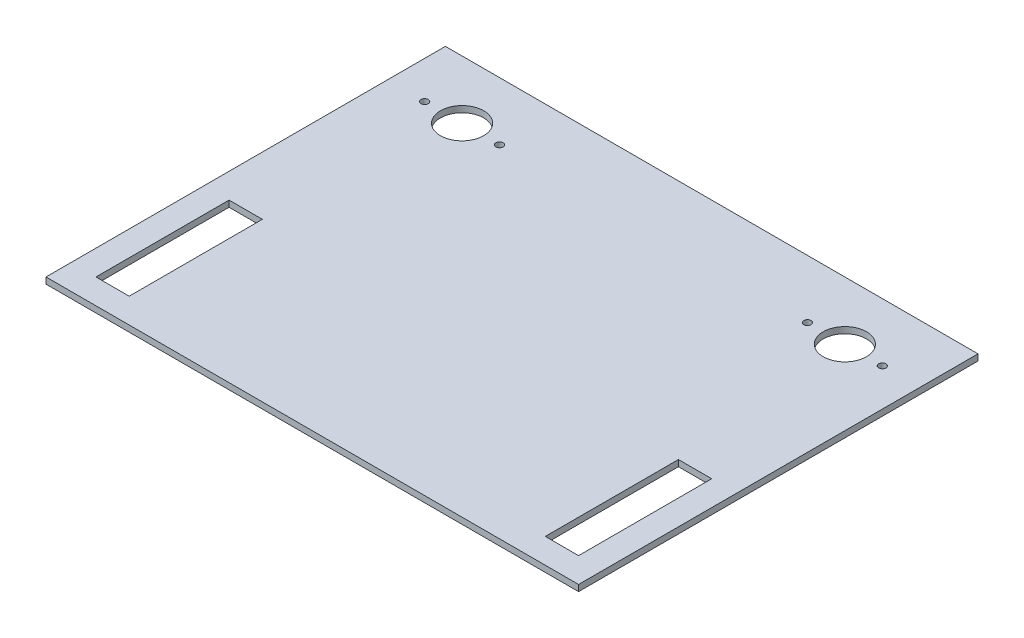
ISO-10303-21;
HEADER;
FILE_DESCRIPTION(('STEP AP214'),'2;1');
FILE_NAME('part.step','',(''),(''),'','','');
FILE_SCHEMA(('AUTOMOTIVE_DESIGN { 1 0 10303 214 1 1 1 1 }'));
ENDSEC;
DATA;
#1=APPLICATION_CONTEXT('core data for automotive mechanical design processes');
#2=APPLICATION_PROTOCOL_DEFINITION('international standard','automotive_design',2000,#1);
#3=PRODUCT_CONTEXT('',#1,'mechanical');
#4=PRODUCT('Part','Part','',(#3));
#5=PRODUCT_RELATED_PRODUCT_CATEGORY('part','',(#4));
#6=PRODUCT_DEFINITION_FORMATION('','',#4);
#7=PRODUCT_DEFINITION_CONTEXT('part definition',#1,'design');
#8=PRODUCT_DEFINITION('design','',#6,#7);
#9=PRODUCT_DEFINITION_SHAPE('','',#8);
#10=(LENGTH_UNIT() NAMED_UNIT(*) SI_UNIT(.MILLI.,.METRE.));
#11=(NAMED_UNIT(*) PLANE_ANGLE_UNIT() SI_UNIT($,.RADIAN.));
#12=(NAMED_UNIT(*) SI_UNIT($,.STERADIAN.) SOLID_ANGLE_UNIT());
#13=UNCERTAINTY_MEASURE_WITH_UNIT(LENGTH_MEASURE(1.E-05),#10,'distance_accuracy_value','');
#14=(GEOMETRIC_REPRESENTATION_CONTEXT(3) GLOBAL_UNCERTAINTY_ASSIGNED_CONTEXT((#13)) GLOBAL_UNIT_ASSIGNED_CONTEXT((#10,
#11,#12)) REPRESENTATION_CONTEXT('',''));
#15=CARTESIAN_POINT('',(0.,0.,0.));
#16=DIRECTION('',(0.,0.,1.));
#17=DIRECTION('',(1.,0.,0.));
#18=AXIS2_PLACEMENT_3D('',#15,#16,#17);
#19=CARTESIAN_POINT('',(0.,4.7625,0.));
#20=DIRECTION('',(1.,0.,0.));
#21=DIRECTION('',(0.,0.,-1.));
#22=AXIS2_PLACEMENT_3D('',#19,#20,#21);
#23=PLANE('',#22);
#24=DIRECTION('',(0.,0.,1.));
#25=VECTOR('',#24,1.);
#26=CARTESIAN_POINT('',(0.,0.,0.));
#27=LINE('',#26,#25);
#28=CARTESIAN_POINT('',(0.,0.,-304.8));
#29=VERTEX_POINT('',#28);
#30=CARTESIAN_POINT('',(0.,0.,0.));
#31=VERTEX_POINT('',#30);
#32=EDGE_CURVE('E216',#29,#31,#27,.T.);
#33=ORIENTED_EDGE('',*,*,#32,.T.);
#34=DIRECTION('',(0.,-1.,0.));
#35=VECTOR('',#34,1.);
#36=CARTESIAN_POINT('',(0.,4.7625,0.));
#37=LINE('',#36,#35);
#38=CARTESIAN_POINT('',(0.,4.7625,0.));
#39=VERTEX_POINT('',#38);
#40=EDGE_CURVE('E239',#39,#31,#37,.T.);
#41=ORIENTED_EDGE('',*,*,#40,.F.);
#42=DIRECTION('',(0.,0.,1.));
#43=VECTOR('',#42,1.);
#44=CARTESIAN_POINT('',(0.,4.7625,0.));
#45=LINE('',#44,#43);
#46=CARTESIAN_POINT('',(0.,4.7625,-304.8));
#47=VERTEX_POINT('',#46);
#48=EDGE_CURVE('E201',#47,#39,#45,.T.);
#49=ORIENTED_EDGE('',*,*,#48,.F.);
#50=DIRECTION('',(0.,-1.,0.));
#51=VECTOR('',#50,1.);
#52=CARTESIAN_POINT('',(0.,4.7625,-304.8));
#53=LINE('',#52,#51);
#54=EDGE_CURVE('E215',#47,#29,#53,.T.);
#55=ORIENTED_EDGE('',*,*,#54,.T.);
#56=EDGE_LOOP('',(#33,#41,#49,#55));
#57=FACE_BOUND('',#56,.T.);
#58=ADVANCED_FACE('F39',(#57),#23,.F.);
#59=CARTESIAN_POINT('',(0.,4.7625,0.));
#60=DIRECTION('',(0.,0.,-1.));
#61=DIRECTION('',(-1.,0.,0.));
#62=AXIS2_PLACEMENT_3D('',#59,#60,#61);
#63=PLANE('',#62);
#64=DIRECTION('',(1.,0.,0.));
#65=VECTOR('',#64,1.);
#66=CARTESIAN_POINT('',(0.,0.,0.));
#67=LINE('',#66,#65);
#68=CARTESIAN_POINT('',(406.4,0.,0.));
#69=VERTEX_POINT('',#68);
#70=EDGE_CURVE('E220',#31,#69,#67,.T.);
#71=ORIENTED_EDGE('',*,*,#70,.T.);
#72=DIRECTION('',(0.,-1.,0.));
#73=VECTOR('',#72,1.);
#74=CARTESIAN_POINT('',(406.4,4.7625,0.));
#75=LINE('',#74,#73);
#76=CARTESIAN_POINT('',(406.4,4.7625,0.));
#77=VERTEX_POINT('',#76);
#78=EDGE_CURVE('E235',#77,#69,#75,.T.);
#79=ORIENTED_EDGE('',*,*,#78,.F.);
#80=DIRECTION('',(1.,0.,0.));
#81=VECTOR('',#80,1.);
#82=CARTESIAN_POINT('',(0.,4.7625,0.));
#83=LINE('',#82,#81);
#84=EDGE_CURVE('E205',#39,#77,#83,.T.);
#85=ORIENTED_EDGE('',*,*,#84,.F.);
#86=ORIENTED_EDGE('',*,*,#40,.T.);
#87=EDGE_LOOP('',(#71,#79,#85,#86));
#88=FACE_BOUND('',#87,.T.);
#89=ADVANCED_FACE('F326',(#88),#63,.F.);
#90=CARTESIAN_POINT('',(406.4,4.7625,0.));
#91=DIRECTION('',(-1.,0.,0.));
#92=DIRECTION('',(0.,0.,1.));
#93=AXIS2_PLACEMENT_3D('',#90,#91,#92);
#94=PLANE('',#93);
#95=DIRECTION('',(0.,0.,-1.));
#96=VECTOR('',#95,1.);
#97=CARTESIAN_POINT('',(406.4,0.,0.));
#98=LINE('',#97,#96);
#99=CARTESIAN_POINT('',(406.4,0.,-304.8));
#100=VERTEX_POINT('',#99);
#101=EDGE_CURVE('E223',#69,#100,#98,.T.);
#102=ORIENTED_EDGE('',*,*,#101,.T.);
#103=DIRECTION('',(0.,-1.,0.));
#104=VECTOR('',#103,1.);
#105=CARTESIAN_POINT('',(406.4,4.7625,-304.8));
#106=LINE('',#105,#104);
#107=CARTESIAN_POINT('',(406.4,4.7625,-304.8));
#108=VERTEX_POINT('',#107);
#109=EDGE_CURVE('E231',#108,#100,#106,.T.);
#110=ORIENTED_EDGE('',*,*,#109,.F.);
#111=DIRECTION('',(0.,0.,-1.));
#112=VECTOR('',#111,1.);
#113=CARTESIAN_POINT('',(406.4,4.7625,0.));
#114=LINE('',#113,#112);
#115=EDGE_CURVE('E209',#77,#108,#114,.T.);
#116=ORIENTED_EDGE('',*,*,#115,.F.);
#117=ORIENTED_EDGE('',*,*,#78,.T.);
#118=EDGE_LOOP('',(#102,#110,#116,#117));
#119=FACE_BOUND('',#118,.T.);
#120=ADVANCED_FACE('F323',(#119),#94,.F.);
#121=CARTESIAN_POINT('',(0.,4.7625,-304.8));
#122=DIRECTION('',(0.,0.,1.));
#123=DIRECTION('',(1.,0.,0.));
#124=AXIS2_PLACEMENT_3D('',#121,#122,#123);
#125=PLANE('',#124);
#126=DIRECTION('',(-1.,0.,0.));
#127=VECTOR('',#126,1.);
#128=CARTESIAN_POINT('',(0.,0.,-304.8));
#129=LINE('',#128,#127);
#130=EDGE_CURVE('E206',#100,#29,#129,.T.);
#131=ORIENTED_EDGE('',*,*,#130,.T.);
#132=ORIENTED_EDGE('',*,*,#54,.F.);
#133=DIRECTION('',(-1.,0.,0.));
#134=VECTOR('',#133,1.);
#135=CARTESIAN_POINT('',(0.,4.7625,-304.8));
#136=LINE('',#135,#134);
#137=EDGE_CURVE('E212',#108,#47,#136,.T.);
#138=ORIENTED_EDGE('',*,*,#137,.F.);
#139=ORIENTED_EDGE('',*,*,#109,.T.);
#140=EDGE_LOOP('',(#131,#132,#138,#139));
#141=FACE_BOUND('',#140,.T.);
#142=ADVANCED_FACE('F319',(#141),#125,.F.);
#143=CARTESIAN_POINT('',(0.,4.7625,0.));
#144=DIRECTION('',(0.,-1.,0.));
#145=DIRECTION('',(0.,0.,-1.));
#146=AXIS2_PLACEMENT_3D('',#143,#144,#145);
#147=PLANE('',#146);
#148=CARTESIAN_POINT('',(28.575,4.7625,-260.35));
#149=DIRECTION('',(0.,1.,0.));
#150=DIRECTION('',(0.,0.,1.));
#151=AXIS2_PLACEMENT_3D('',#148,#149,#150);
#152=CIRCLE('',#151,2.778125);
#153=CARTESIAN_POINT('',(28.575,4.7625,-257.571875));
#154=VERTEX_POINT('',#153);
#155=EDGE_CURVE('E499',#154,#154,#152,.T.);
#156=ORIENTED_EDGE('',*,*,#155,.F.);
#157=EDGE_LOOP('',(#156));
#158=FACE_BOUND('',#157,.T.);
#159=CARTESIAN_POINT('',(85.725,4.7625,-260.35));
#160=DIRECTION('',(0.,1.,0.));
#161=DIRECTION('',(0.,0.,1.));
#162=AXIS2_PLACEMENT_3D('',#159,#160,#161);
#163=CIRCLE('',#162,2.77812499999999);
#164=CARTESIAN_POINT('',(85.725,4.7625,-257.571875));
#165=VERTEX_POINT('',#164);
#166=EDGE_CURVE('E173',#165,#165,#163,.T.);
#167=ORIENTED_EDGE('',*,*,#166,.F.);
#168=EDGE_LOOP('',(#167));
#169=FACE_BOUND('',#168,.T.);
#170=CARTESIAN_POINT('',(57.15,4.7625,-260.35));
#171=DIRECTION('',(0.,1.,0.));
#172=DIRECTION('',(0.,0.,1.));
#173=AXIS2_PLACEMENT_3D('',#170,#171,#172);
#174=CIRCLE('',#173,16.51);
#175=CARTESIAN_POINT('',(57.15,4.7625,-243.84));
#176=VERTEX_POINT('',#175);
#177=EDGE_CURVE('E169',#176,#176,#174,.T.);
#178=ORIENTED_EDGE('',*,*,#177,.F.);
#179=EDGE_LOOP('',(#178));
#180=FACE_BOUND('',#179,.T.);
#181=DIRECTION('',(-1.,0.,0.));
#182=VECTOR('',#181,1.);
#183=CARTESIAN_POINT('',(387.35,4.7625,-120.65));
#184=LINE('',#183,#182);
#185=CARTESIAN_POINT('',(387.35,4.7625,-120.65));
#186=VERTEX_POINT('',#185);
#187=CARTESIAN_POINT('',(361.95,4.7625,-120.65));
#188=VERTEX_POINT('',#187);
#189=EDGE_CURVE('E147',#186,#188,#184,.T.);
#190=ORIENTED_EDGE('',*,*,#189,.F.);
#191=DIRECTION('',(0.,0.,-1.));
#192=VECTOR('',#191,1.);
#193=CARTESIAN_POINT('',(387.35,4.7625,-19.05));
#194=LINE('',#193,#192);
#195=CARTESIAN_POINT('',(387.35,4.7625,-19.05));
#196=VERTEX_POINT('',#195);
#197=EDGE_CURVE('E56',#196,#186,#194,.T.);
#198=ORIENTED_EDGE('',*,*,#197,.F.);
#199=DIRECTION('',(1.,0.,0.));
#200=VECTOR('',#199,1.);
#201=CARTESIAN_POINT('',(387.35,4.7625,-19.05));
#202=LINE('',#201,#200);
#203=CARTESIAN_POINT('',(361.95,4.7625,-19.05));
#204=VERTEX_POINT('',#203);
#205=EDGE_CURVE('E155',#204,#196,#202,.T.);
#206=ORIENTED_EDGE('',*,*,#205,.F.);
#207=DIRECTION('',(0.,0.,1.));
#208=VECTOR('',#207,1.);
#209=CARTESIAN_POINT('',(361.95,4.7625,-19.05));
#210=LINE('',#209,#208);
#211=EDGE_CURVE('E136',#188,#204,#210,.T.);
#212=ORIENTED_EDGE('',*,*,#211,.F.);
#213=EDGE_LOOP('',(#190,#198,#206,#212));
#214=FACE_BOUND('',#213,.T.);
#215=CARTESIAN_POINT('',(349.25,4.7625,-260.35));
#216=DIRECTION('',(0.,1.,0.));
#217=DIRECTION('',(0.,0.,-1.));
#218=AXIS2_PLACEMENT_3D('',#215,#216,#217);
#219=CIRCLE('',#218,16.51);
#220=CARTESIAN_POINT('',(349.25,4.7625,-276.86));
#221=VERTEX_POINT('',#220);
#222=EDGE_CURVE('E511',#221,#221,#219,.T.);
#223=ORIENTED_EDGE('',*,*,#222,.F.);
#224=EDGE_LOOP('',(#223));
#225=FACE_BOUND('',#224,.T.);
#226=CARTESIAN_POINT('',(320.675,4.7625,-260.35));
#227=DIRECTION('',(0.,1.,0.));
#228=DIRECTION('',(0.,0.,-1.));
#229=AXIS2_PLACEMENT_3D('',#226,#227,#228);
#230=CIRCLE('',#229,2.77812500000002);
#231=CARTESIAN_POINT('',(320.675,4.7625,-263.128125));
#232=VERTEX_POINT('',#231);
#233=EDGE_CURVE('E506',#232,#232,#230,.T.);
#234=ORIENTED_EDGE('',*,*,#233,.F.);
#235=EDGE_LOOP('',(#234));
#236=FACE_BOUND('',#235,.T.);
#237=CARTESIAN_POINT('',(377.825,4.7625,-260.35));
#238=DIRECTION('',(0.,1.,0.));
#239=DIRECTION('',(0.,0.,-1.));
#240=AXIS2_PLACEMENT_3D('',#237,#238,#239);
#241=CIRCLE('',#240,2.77812500000002);
#242=CARTESIAN_POINT('',(377.825,4.7625,-263.128125));
#243=VERTEX_POINT('',#242);
#244=EDGE_CURVE('E503',#243,#243,#241,.T.);
#245=ORIENTED_EDGE('',*,*,#244,.F.);
#246=EDGE_LOOP('',(#245));
#247=FACE_BOUND('',#246,.T.);
#248=DIRECTION('',(1.,0.,0.));
#249=VECTOR('',#248,1.);
#250=CARTESIAN_POINT('',(19.05,4.7625,-19.05));
#251=LINE('',#250,#249);
#252=CARTESIAN_POINT('',(19.05,4.7625,-19.05));
#253=VERTEX_POINT('',#252);
#254=CARTESIAN_POINT('',(44.45,4.7625,-19.05));
#255=VERTEX_POINT('',#254);
#256=EDGE_CURVE('E176',#253,#255,#251,.T.);
#257=ORIENTED_EDGE('',*,*,#256,.F.);
#258=DIRECTION('',(0.,0.,1.));
#259=VECTOR('',#258,1.);
#260=CARTESIAN_POINT('',(19.05,4.7625,-19.05));
#261=LINE('',#260,#259);
#262=CARTESIAN_POINT('',(19.05,4.7625,-120.65));
#263=VERTEX_POINT('',#262);
#264=EDGE_CURVE('E64',#263,#253,#261,.T.);
#265=ORIENTED_EDGE('',*,*,#264,.F.);
#266=DIRECTION('',(-1.,0.,0.));
#267=VECTOR('',#266,1.);
#268=CARTESIAN_POINT('',(19.05,4.7625,-120.65));
#269=LINE('',#268,#267);
#270=CARTESIAN_POINT('',(44.45,4.7625,-120.65));
#271=VERTEX_POINT('',#270);
#272=EDGE_CURVE('E184',#271,#263,#269,.T.);
#273=ORIENTED_EDGE('',*,*,#272,.F.);
#274=DIRECTION('',(0.,0.,-1.));
#275=VECTOR('',#274,1.);
#276=CARTESIAN_POINT('',(44.45,4.7625,-19.05));
#277=LINE('',#276,#275);
#278=EDGE_CURVE('E180',#255,#271,#277,.T.);
#279=ORIENTED_EDGE('',*,*,#278,.F.);
#280=EDGE_LOOP('',(#257,#265,#273,#279));
#281=FACE_BOUND('',#280,.T.);
#282=ORIENTED_EDGE('',*,*,#48,.T.);
#283=ORIENTED_EDGE('',*,*,#84,.T.);
#284=ORIENTED_EDGE('',*,*,#115,.T.);
#285=ORIENTED_EDGE('',*,*,#137,.T.);
#286=EDGE_LOOP('',(#282,#283,#284,#285));
#287=FACE_BOUND('',#286,.T.);
#288=ADVANCED_FACE('F152',(#158,#169,#180,#214,#225,#236,#247,#281,#287),#147,.F.);
#289=CARTESIAN_POINT('',(0.,0.,0.));
#290=DIRECTION('',(0.,-1.,0.));
#291=DIRECTION('',(0.,0.,-1.));
#292=AXIS2_PLACEMENT_3D('',#289,#290,#291);
#293=PLANE('',#292);
#294=CARTESIAN_POINT('',(28.575,0.,-260.35));
#295=DIRECTION('',(0.,-1.,0.));
#296=DIRECTION('',(0.,0.,-1.));
#297=AXIS2_PLACEMENT_3D('',#294,#295,#296);
#298=CIRCLE('',#297,2.778125);
#299=CARTESIAN_POINT('',(28.575,0.,-263.128125));
#300=VERTEX_POINT('',#299);
#301=EDGE_CURVE('E42',#300,#300,#298,.T.);
#302=ORIENTED_EDGE('',*,*,#301,.F.);
#303=EDGE_LOOP('',(#302));
#304=FACE_BOUND('',#303,.T.);
#305=CARTESIAN_POINT('',(85.725,0.,-260.35));
#306=DIRECTION('',(0.,-1.,0.));
#307=DIRECTION('',(0.,0.,-1.));
#308=AXIS2_PLACEMENT_3D('',#305,#306,#307);
#309=CIRCLE('',#308,2.77812499999999);
#310=CARTESIAN_POINT('',(85.725,0.,-263.128125));
#311=VERTEX_POINT('',#310);
#312=EDGE_CURVE('E277',#311,#311,#309,.T.);
#313=ORIENTED_EDGE('',*,*,#312,.F.);
#314=EDGE_LOOP('',(#313));
#315=FACE_BOUND('',#314,.T.);
#316=CARTESIAN_POINT('',(57.15,0.,-260.35));
#317=DIRECTION('',(0.,-1.,0.));
#318=DIRECTION('',(0.,0.,-1.));
#319=AXIS2_PLACEMENT_3D('',#316,#317,#318);
#320=CIRCLE('',#319,16.51);
#321=CARTESIAN_POINT('',(57.15,0.,-276.86));
#322=VERTEX_POINT('',#321);
#323=EDGE_CURVE('E268',#322,#322,#320,.T.);
#324=ORIENTED_EDGE('',*,*,#323,.F.);
#325=EDGE_LOOP('',(#324));
#326=FACE_BOUND('',#325,.T.);
#327=DIRECTION('',(0.,0.,1.));
#328=VECTOR('',#327,1.);
#329=CARTESIAN_POINT('',(387.35,0.,0.));
#330=LINE('',#329,#328);
#331=CARTESIAN_POINT('',(387.35,0.,-120.65));
#332=VERTEX_POINT('',#331);
#333=CARTESIAN_POINT('',(387.35,0.,-19.05));
#334=VERTEX_POINT('',#333);
#335=EDGE_CURVE('E11',#332,#334,#330,.T.);
#336=ORIENTED_EDGE('',*,*,#335,.F.);
#337=DIRECTION('',(1.,0.,0.));
#338=VECTOR('',#337,1.);
#339=CARTESIAN_POINT('',(0.,0.,-120.65));
#340=LINE('',#339,#338);
#341=CARTESIAN_POINT('',(361.95,0.,-120.65));
#342=VERTEX_POINT('',#341);
#343=EDGE_CURVE('E256',#342,#332,#340,.T.);
#344=ORIENTED_EDGE('',*,*,#343,.F.);
#345=DIRECTION('',(0.,0.,-1.));
#346=VECTOR('',#345,1.);
#347=CARTESIAN_POINT('',(361.95,0.,0.));
#348=LINE('',#347,#346);
#349=CARTESIAN_POINT('',(361.95,0.,-19.05));
#350=VERTEX_POINT('',#349);
#351=EDGE_CURVE('E139',#350,#342,#348,.T.);
#352=ORIENTED_EDGE('',*,*,#351,.F.);
#353=DIRECTION('',(-1.,0.,0.));
#354=VECTOR('',#353,1.);
#355=CARTESIAN_POINT('',(0.,0.,-19.0499999999999));
#356=LINE('',#355,#354);
#357=EDGE_CURVE('E48',#334,#350,#356,.T.);
#358=ORIENTED_EDGE('',*,*,#357,.F.);
#359=EDGE_LOOP('',(#336,#344,#352,#358));
#360=FACE_BOUND('',#359,.T.);
#361=CARTESIAN_POINT('',(349.25,0.,-260.35));
#362=DIRECTION('',(0.,-1.,0.));
#363=DIRECTION('',(0.,0.,-1.));
#364=AXIS2_PLACEMENT_3D('',#361,#362,#363);
#365=CIRCLE('',#364,16.51);
#366=CARTESIAN_POINT('',(349.25,0.,-276.86));
#367=VERTEX_POINT('',#366);
#368=EDGE_CURVE('E264',#367,#367,#365,.T.);
#369=ORIENTED_EDGE('',*,*,#368,.F.);
#370=EDGE_LOOP('',(#369));
#371=FACE_BOUND('',#370,.T.);
#372=CARTESIAN_POINT('',(320.675,0.,-260.35));
#373=DIRECTION('',(0.,-1.,0.));
#374=DIRECTION('',(0.,0.,-1.));
#375=AXIS2_PLACEMENT_3D('',#372,#373,#374);
#376=CIRCLE('',#375,2.77812500000002);
#377=CARTESIAN_POINT('',(320.675,0.,-263.128125));
#378=VERTEX_POINT('',#377);
#379=EDGE_CURVE('E260',#378,#378,#376,.T.);
#380=ORIENTED_EDGE('',*,*,#379,.F.);
#381=EDGE_LOOP('',(#380));
#382=FACE_BOUND('',#381,.T.);
#383=CARTESIAN_POINT('',(377.825,0.,-260.35));
#384=DIRECTION('',(0.,-1.,0.));
#385=DIRECTION('',(0.,0.,-1.));
#386=AXIS2_PLACEMENT_3D('',#383,#384,#385);
#387=CIRCLE('',#386,2.77812500000002);
#388=CARTESIAN_POINT('',(377.825,0.,-263.128125));
#389=VERTEX_POINT('',#388);
#390=EDGE_CURVE('E192',#389,#389,#387,.T.);
#391=ORIENTED_EDGE('',*,*,#390,.F.);
#392=EDGE_LOOP('',(#391));
#393=FACE_BOUND('',#392,.T.);
#394=DIRECTION('',(0.,0.,-1.));
#395=VECTOR('',#394,1.);
#396=CARTESIAN_POINT('',(19.05,0.,0.));
#397=LINE('',#396,#395);
#398=CARTESIAN_POINT('',(19.05,0.,-19.05));
#399=VERTEX_POINT('',#398);
#400=CARTESIAN_POINT('',(19.05,0.,-120.65));
#401=VERTEX_POINT('',#400);
#402=EDGE_CURVE('E253',#399,#401,#397,.T.);
#403=ORIENTED_EDGE('',*,*,#402,.F.);
#404=DIRECTION('',(-1.,0.,0.));
#405=VECTOR('',#404,1.);
#406=CARTESIAN_POINT('',(0.,0.,-19.05));
#407=LINE('',#406,#405);
#408=CARTESIAN_POINT('',(44.45,0.,-19.05));
#409=VERTEX_POINT('',#408);
#410=EDGE_CURVE('E243',#409,#399,#407,.T.);
#411=ORIENTED_EDGE('',*,*,#410,.F.);
#412=DIRECTION('',(0.,0.,1.));
#413=VECTOR('',#412,1.);
#414=CARTESIAN_POINT('',(44.45,0.,0.));
#415=LINE('',#414,#413);
#416=CARTESIAN_POINT('',(44.45,0.,-120.65));
#417=VERTEX_POINT('',#416);
#418=EDGE_CURVE('E246',#417,#409,#415,.T.);
#419=ORIENTED_EDGE('',*,*,#418,.F.);
#420=DIRECTION('',(1.,0.,0.));
#421=VECTOR('',#420,1.);
#422=CARTESIAN_POINT('',(0.,0.,-120.65));
#423=LINE('',#422,#421);
#424=EDGE_CURVE('E250',#401,#417,#423,.T.);
#425=ORIENTED_EDGE('',*,*,#424,.F.);
#426=EDGE_LOOP('',(#403,#411,#419,#425));
#427=FACE_BOUND('',#426,.T.);
#428=ORIENTED_EDGE('',*,*,#32,.F.);
#429=ORIENTED_EDGE('',*,*,#130,.F.);
#430=ORIENTED_EDGE('',*,*,#101,.F.);
#431=ORIENTED_EDGE('',*,*,#70,.F.);
#432=EDGE_LOOP('',(#428,#429,#430,#431));
#433=FACE_BOUND('',#432,.T.);
#434=ADVANCED_FACE('F289',(#304,#315,#326,#360,#371,#382,#393,#427,#433),#293,.T.);
#435=CARTESIAN_POINT('',(19.05,-1.5875,-19.05));
#436=DIRECTION('',(-1.,0.,0.));
#437=DIRECTION('',(0.,0.,1.));
#438=AXIS2_PLACEMENT_3D('',#435,#436,#437);
#439=PLANE('',#438);
#440=ORIENTED_EDGE('',*,*,#402,.T.);
#441=DIRECTION('',(0.,1.,0.));
#442=VECTOR('',#441,1.);
#443=CARTESIAN_POINT('',(19.05,-1.5875,-120.65));
#444=LINE('',#443,#442);
#445=EDGE_CURVE('E189',#401,#263,#444,.T.);
#446=ORIENTED_EDGE('',*,*,#445,.T.);
#447=ORIENTED_EDGE('',*,*,#264,.T.);
#448=DIRECTION('',(0.,1.,0.));
#449=VECTOR('',#448,1.);
#450=CARTESIAN_POINT('',(19.05,-1.5875,-19.05));
#451=LINE('',#450,#449);
#452=EDGE_CURVE('E188',#399,#253,#451,.T.);
#453=ORIENTED_EDGE('',*,*,#452,.F.);
#454=EDGE_LOOP('',(#440,#446,#447,#453));
#455=FACE_BOUND('',#454,.T.);
#456=ADVANCED_FACE('F292',(#455),#439,.F.);
#457=CARTESIAN_POINT('',(19.05,-1.5875,-120.65));
#458=DIRECTION('',(0.,0.,-1.));
#459=DIRECTION('',(-1.,0.,0.));
#460=AXIS2_PLACEMENT_3D('',#457,#458,#459);
#461=PLANE('',#460);
#462=ORIENTED_EDGE('',*,*,#424,.T.);
#463=DIRECTION('',(0.,1.,0.));
#464=VECTOR('',#463,1.);
#465=CARTESIAN_POINT('',(44.45,-1.5875,-120.65));
#466=LINE('',#465,#464);
#467=EDGE_CURVE('E193',#417,#271,#466,.T.);
#468=ORIENTED_EDGE('',*,*,#467,.T.);
#469=ORIENTED_EDGE('',*,*,#272,.T.);
#470=ORIENTED_EDGE('',*,*,#445,.F.);
#471=EDGE_LOOP('',(#462,#468,#469,#470));
#472=FACE_BOUND('',#471,.T.);
#473=ADVANCED_FACE('F371',(#472),#461,.F.);
#474=CARTESIAN_POINT('',(44.45,-1.5875,-19.05));
#475=DIRECTION('',(1.,0.,0.));
#476=DIRECTION('',(0.,0.,-1.));
#477=AXIS2_PLACEMENT_3D('',#474,#475,#476);
#478=PLANE('',#477);
#479=ORIENTED_EDGE('',*,*,#418,.T.);
#480=DIRECTION('',(0.,1.,0.));
#481=VECTOR('',#480,1.);
#482=CARTESIAN_POINT('',(44.45,-1.5875,-19.05));
#483=LINE('',#482,#481);
#484=EDGE_CURVE('E196',#409,#255,#483,.T.);
#485=ORIENTED_EDGE('',*,*,#484,.T.);
#486=ORIENTED_EDGE('',*,*,#278,.T.);
#487=ORIENTED_EDGE('',*,*,#467,.F.);
#488=EDGE_LOOP('',(#479,#485,#486,#487));
#489=FACE_BOUND('',#488,.T.);
#490=ADVANCED_FACE('F379',(#489),#478,.F.);
#491=CARTESIAN_POINT('',(19.05,-1.5875,-19.05));
#492=DIRECTION('',(0.,0.,1.));
#493=DIRECTION('',(1.,0.,0.));
#494=AXIS2_PLACEMENT_3D('',#491,#492,#493);
#495=PLANE('',#494);
#496=ORIENTED_EDGE('',*,*,#410,.T.);
#497=ORIENTED_EDGE('',*,*,#452,.T.);
#498=ORIENTED_EDGE('',*,*,#256,.T.);
#499=ORIENTED_EDGE('',*,*,#484,.F.);
#500=EDGE_LOOP('',(#496,#497,#498,#499));
#501=FACE_BOUND('',#500,.T.);
#502=ADVANCED_FACE('F389',(#501),#495,.F.);
#503=CARTESIAN_POINT('',(377.825,-1.5875,-260.35));
#504=DIRECTION('',(0.,1.,0.));
#505=DIRECTION('',(0.,0.,1.));
#506=AXIS2_PLACEMENT_3D('',#503,#504,#505);
#507=CYLINDRICAL_SURFACE('',#506,2.77812500000002);
#508=ORIENTED_EDGE('',*,*,#390,.T.);
#509=EDGE_LOOP('',(#508));
#510=FACE_BOUND('',#509,.T.);
#511=ORIENTED_EDGE('',*,*,#244,.T.);
#512=EDGE_LOOP('',(#511));
#513=FACE_BOUND('',#512,.T.);
#514=ADVANCED_FACE('F399',(#510,#513),#507,.F.);
#515=CARTESIAN_POINT('',(320.675,-1.5875,-260.35));
#516=DIRECTION('',(0.,1.,0.));
#517=DIRECTION('',(0.,0.,1.));
#518=AXIS2_PLACEMENT_3D('',#515,#516,#517);
#519=CYLINDRICAL_SURFACE('',#518,2.77812500000002);
#520=ORIENTED_EDGE('',*,*,#379,.T.);
#521=EDGE_LOOP('',(#520));
#522=FACE_BOUND('',#521,.T.);
#523=ORIENTED_EDGE('',*,*,#233,.T.);
#524=EDGE_LOOP('',(#523));
#525=FACE_BOUND('',#524,.T.);
#526=ADVANCED_FACE('F409',(#522,#525),#519,.F.);
#527=CARTESIAN_POINT('',(349.25,-1.5875,-260.35));
#528=DIRECTION('',(0.,1.,0.));
#529=DIRECTION('',(0.,0.,1.));
#530=AXIS2_PLACEMENT_3D('',#527,#528,#529);
#531=CYLINDRICAL_SURFACE('',#530,16.51);
#532=ORIENTED_EDGE('',*,*,#368,.T.);
#533=EDGE_LOOP('',(#532));
#534=FACE_BOUND('',#533,.T.);
#535=ORIENTED_EDGE('',*,*,#222,.T.);
#536=EDGE_LOOP('',(#535));
#537=FACE_BOUND('',#536,.T.);
#538=ADVANCED_FACE('F419',(#534,#537),#531,.F.);
#539=CARTESIAN_POINT('',(387.35,-1.5875,-19.05));
#540=DIRECTION('',(1.,0.,0.));
#541=DIRECTION('',(0.,0.,-1.));
#542=AXIS2_PLACEMENT_3D('',#539,#540,#541);
#543=PLANE('',#542);
#544=ORIENTED_EDGE('',*,*,#335,.T.);
#545=DIRECTION('',(0.,1.,0.));
#546=VECTOR('',#545,1.);
#547=CARTESIAN_POINT('',(387.35,-1.5875,-19.05));
#548=LINE('',#547,#546);
#549=EDGE_CURVE('E162',#334,#196,#548,.T.);
#550=ORIENTED_EDGE('',*,*,#549,.T.);
#551=ORIENTED_EDGE('',*,*,#197,.T.);
#552=DIRECTION('',(0.,1.,0.));
#553=VECTOR('',#552,1.);
#554=CARTESIAN_POINT('',(387.35,-1.5875,-120.65));
#555=LINE('',#554,#553);
#556=EDGE_CURVE('E144',#332,#186,#555,.T.);
#557=ORIENTED_EDGE('',*,*,#556,.F.);
#558=EDGE_LOOP('',(#544,#550,#551,#557));
#559=FACE_BOUND('',#558,.T.);
#560=ADVANCED_FACE('F429',(#559),#543,.F.);
#561=CARTESIAN_POINT('',(387.35,-1.5875,-19.05));
#562=DIRECTION('',(0.,0.,1.));
#563=DIRECTION('',(1.,0.,0.));
#564=AXIS2_PLACEMENT_3D('',#561,#562,#563);
#565=PLANE('',#564);
#566=ORIENTED_EDGE('',*,*,#357,.T.);
#567=DIRECTION('',(0.,1.,0.));
#568=VECTOR('',#567,1.);
#569=CARTESIAN_POINT('',(361.95,-1.5875,-19.05));
#570=LINE('',#569,#568);
#571=EDGE_CURVE('E143',#350,#204,#570,.T.);
#572=ORIENTED_EDGE('',*,*,#571,.T.);
#573=ORIENTED_EDGE('',*,*,#205,.T.);
#574=ORIENTED_EDGE('',*,*,#549,.F.);
#575=EDGE_LOOP('',(#566,#572,#573,#574));
#576=FACE_BOUND('',#575,.T.);
#577=ADVANCED_FACE('F439',(#576),#565,.F.);
#578=CARTESIAN_POINT('',(361.95,-1.5875,-19.05));
#579=DIRECTION('',(-1.,0.,0.));
#580=DIRECTION('',(0.,0.,1.));
#581=AXIS2_PLACEMENT_3D('',#578,#579,#580);
#582=PLANE('',#581);
#583=ORIENTED_EDGE('',*,*,#351,.T.);
#584=DIRECTION('',(0.,1.,0.));
#585=VECTOR('',#584,1.);
#586=CARTESIAN_POINT('',(361.95,-1.5875,-120.65));
#587=LINE('',#586,#585);
#588=EDGE_CURVE('E131',#342,#188,#587,.T.);
#589=ORIENTED_EDGE('',*,*,#588,.T.);
#590=ORIENTED_EDGE('',*,*,#211,.T.);
#591=ORIENTED_EDGE('',*,*,#571,.F.);
#592=EDGE_LOOP('',(#583,#589,#590,#591));
#593=FACE_BOUND('',#592,.T.);
#594=ADVANCED_FACE('F133',(#593),#582,.F.);
#595=CARTESIAN_POINT('',(387.35,-1.5875,-120.65));
#596=DIRECTION('',(0.,0.,-1.));
#597=DIRECTION('',(-1.,0.,0.));
#598=AXIS2_PLACEMENT_3D('',#595,#596,#597);
#599=PLANE('',#598);
#600=ORIENTED_EDGE('',*,*,#343,.T.);
#601=ORIENTED_EDGE('',*,*,#556,.T.);
#602=ORIENTED_EDGE('',*,*,#189,.T.);
#603=ORIENTED_EDGE('',*,*,#588,.F.);
#604=EDGE_LOOP('',(#600,#601,#602,#603));
#605=FACE_BOUND('',#604,.T.);
#606=ADVANCED_FACE('F148',(#605),#599,.F.);
#607=CARTESIAN_POINT('',(57.15,-1.5875,-260.35));
#608=DIRECTION('',(0.,1.,0.));
#609=DIRECTION('',(0.,0.,1.));
#610=AXIS2_PLACEMENT_3D('',#607,#608,#609);
#611=CYLINDRICAL_SURFACE('',#610,16.51);
#612=ORIENTED_EDGE('',*,*,#323,.T.);
#613=EDGE_LOOP('',(#612));
#614=FACE_BOUND('',#613,.T.);
#615=ORIENTED_EDGE('',*,*,#177,.T.);
#616=EDGE_LOOP('',(#615));
#617=FACE_BOUND('',#616,.T.);
#618=ADVANCED_FACE('F465',(#614,#617),#611,.F.);
#619=CARTESIAN_POINT('',(85.725,-1.5875,-260.35));
#620=DIRECTION('',(0.,1.,0.));
#621=DIRECTION('',(0.,0.,1.));
#622=AXIS2_PLACEMENT_3D('',#619,#620,#621);
#623=CYLINDRICAL_SURFACE('',#622,2.77812499999999);
#624=ORIENTED_EDGE('',*,*,#312,.T.);
#625=EDGE_LOOP('',(#624));
#626=FACE_BOUND('',#625,.T.);
#627=ORIENTED_EDGE('',*,*,#166,.T.);
#628=EDGE_LOOP('',(#627));
#629=FACE_BOUND('',#628,.T.);
#630=ADVANCED_FACE('F474',(#626,#629),#623,.F.);
#631=CARTESIAN_POINT('',(28.575,-1.5875,-260.35));
#632=DIRECTION('',(0.,1.,0.));
#633=DIRECTION('',(0.,0.,1.));
#634=AXIS2_PLACEMENT_3D('',#631,#632,#633);
#635=CYLINDRICAL_SURFACE('',#634,2.778125);
#636=ORIENTED_EDGE('',*,*,#301,.T.);
#637=EDGE_LOOP('',(#636));
#638=FACE_BOUND('',#637,.T.);
#639=ORIENTED_EDGE('',*,*,#155,.T.);
#640=EDGE_LOOP('',(#639));
#641=FACE_BOUND('',#640,.T.);
#642=ADVANCED_FACE('F286',(#638,#641),#635,.F.);
#643=CLOSED_SHELL('',(#58,#89,#120,#142,#288,#434,#456,#473,#490,#502,#514,#526,#538,#560,#577,
#594,#606,#618,#630,#642));
#644=MANIFOLD_SOLID_BREP('B2',#643);
#645=ADVANCED_BREP_SHAPE_REPRESENTATION('',(#18,#644),#14);
#646=SHAPE_DEFINITION_REPRESENTATION(#9,#645);
ENDSEC;
END-ISO-10303-21;
